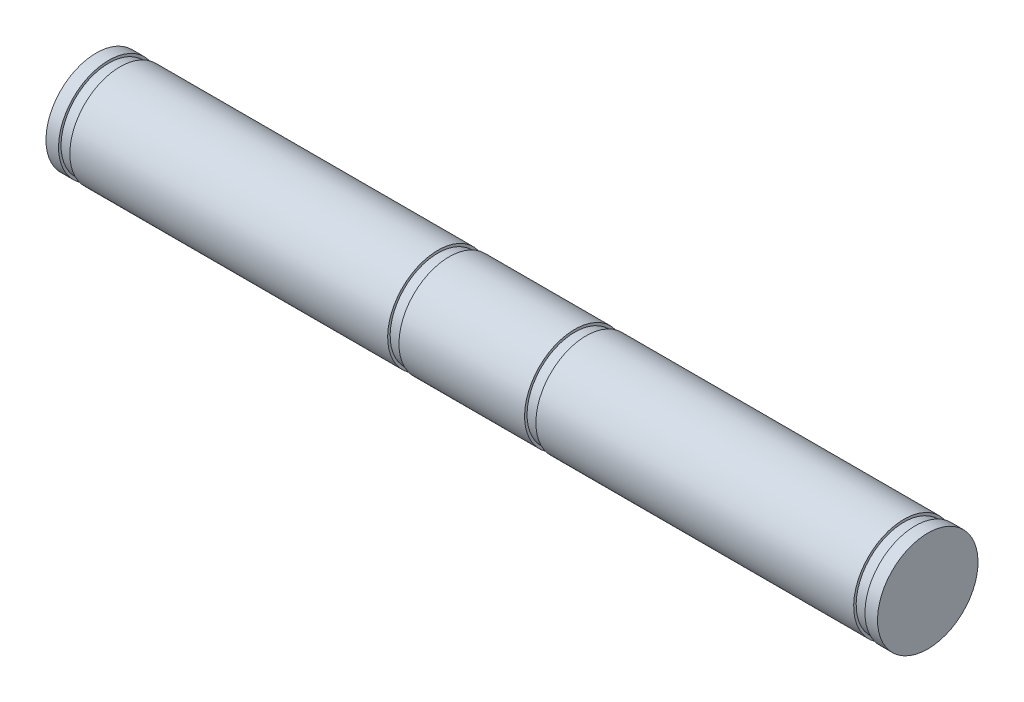
ISO-10303-21;
HEADER;
FILE_DESCRIPTION(('STEP AP214'),'2;1');
FILE_NAME('part.step','',(''),(''),'','','');
FILE_SCHEMA(('AUTOMOTIVE_DESIGN { 1 0 10303 214 1 1 1 1 }'));
ENDSEC;
DATA;
#1=APPLICATION_CONTEXT('core data for automotive mechanical design processes');
#2=APPLICATION_PROTOCOL_DEFINITION('international standard','automotive_design',2000,#1);
#3=PRODUCT_CONTEXT('',#1,'mechanical');
#4=PRODUCT('Part','Part','',(#3));
#5=PRODUCT_RELATED_PRODUCT_CATEGORY('part','',(#4));
#6=PRODUCT_DEFINITION_FORMATION('','',#4);
#7=PRODUCT_DEFINITION_CONTEXT('part definition',#1,'design');
#8=PRODUCT_DEFINITION('design','',#6,#7);
#9=PRODUCT_DEFINITION_SHAPE('','',#8);
#10=(LENGTH_UNIT() NAMED_UNIT(*) SI_UNIT(.MILLI.,.METRE.));
#11=(NAMED_UNIT(*) PLANE_ANGLE_UNIT() SI_UNIT($,.RADIAN.));
#12=(NAMED_UNIT(*) SI_UNIT($,.STERADIAN.) SOLID_ANGLE_UNIT());
#13=UNCERTAINTY_MEASURE_WITH_UNIT(LENGTH_MEASURE(1.E-05),#10,'distance_accuracy_value','');
#14=(GEOMETRIC_REPRESENTATION_CONTEXT(3) GLOBAL_UNCERTAINTY_ASSIGNED_CONTEXT((#13)) GLOBAL_UNIT_ASSIGNED_CONTEXT((#10,
#11,#12)) REPRESENTATION_CONTEXT('',''));
#15=CARTESIAN_POINT('',(0.,0.,0.));
#16=DIRECTION('',(0.,0.,1.));
#17=DIRECTION('',(1.,0.,0.));
#18=AXIS2_PLACEMENT_3D('',#15,#16,#17);
#19=CARTESIAN_POINT('',(64.3,0.,0.));
#20=DIRECTION('',(-1.,0.,0.));
#21=DIRECTION('',(0.,-1.,0.));
#22=AXIS2_PLACEMENT_3D('',#19,#20,#21);
#23=PLANE('',#22);
#24=CARTESIAN_POINT('',(64.3,0.,0.));
#25=DIRECTION('',(-1.,0.,0.));
#26=DIRECTION('',(0.,-1.,0.));
#27=AXIS2_PLACEMENT_3D('',#24,#25,#26);
#28=CIRCLE('',#27,3.99999999999999);
#29=CARTESIAN_POINT('',(64.3,-3.99999999999998,0.));
#30=VERTEX_POINT('',#29);
#31=EDGE_CURVE('E10',#30,#30,#28,.T.);
#32=ORIENTED_EDGE('',*,*,#31,.F.);
#33=EDGE_LOOP('',(#32));
#34=FACE_BOUND('',#33,.T.);
#35=ADVANCED_FACE('F35',(#34),#23,.F.);
#36=CARTESIAN_POINT('',(0.,0.,0.));
#37=DIRECTION('',(-1.,0.,0.));
#38=DIRECTION('',(0.,-1.,0.));
#39=AXIS2_PLACEMENT_3D('',#36,#37,#38);
#40=CYLINDRICAL_SURFACE('',#39,3.99999999999999);
#41=CARTESIAN_POINT('',(63.3,0.,0.));
#42=DIRECTION('',(-1.,0.,0.));
#43=DIRECTION('',(0.,-1.,0.));
#44=AXIS2_PLACEMENT_3D('',#41,#42,#43);
#45=CIRCLE('',#44,3.99999999999999);
#46=CARTESIAN_POINT('',(63.3,-3.99999999999998,0.));
#47=VERTEX_POINT('',#46);
#48=EDGE_CURVE('E41',#47,#47,#45,.T.);
#49=ORIENTED_EDGE('',*,*,#48,.F.);
#50=EDGE_LOOP('',(#49));
#51=FACE_BOUND('',#50,.T.);
#52=ORIENTED_EDGE('',*,*,#31,.T.);
#53=EDGE_LOOP('',(#52));
#54=FACE_BOUND('',#53,.T.);
#55=ADVANCED_FACE('F113',(#51,#54),#40,.T.);
#56=CARTESIAN_POINT('',(63.3,0.,0.));
#57=DIRECTION('',(1.,0.,0.));
#58=DIRECTION('',(0.,1.,0.));
#59=AXIS2_PLACEMENT_3D('',#56,#57,#58);
#60=PLANE('',#59);
#61=CARTESIAN_POINT('',(63.3,0.,0.));
#62=DIRECTION('',(-1.,0.,0.));
#63=DIRECTION('',(0.,-1.,0.));
#64=AXIS2_PLACEMENT_3D('',#61,#62,#63);
#65=CIRCLE('',#64,3.79999999999999);
#66=CARTESIAN_POINT('',(63.3,-3.79999999999998,0.));
#67=VERTEX_POINT('',#66);
#68=EDGE_CURVE('E45',#67,#67,#65,.T.);
#69=ORIENTED_EDGE('',*,*,#68,.F.);
#70=EDGE_LOOP('',(#69));
#71=FACE_BOUND('',#70,.T.);
#72=ORIENTED_EDGE('',*,*,#48,.T.);
#73=EDGE_LOOP('',(#72));
#74=FACE_BOUND('',#73,.T.);
#75=ADVANCED_FACE('F118',(#71,#74),#60,.F.);
#76=CARTESIAN_POINT('',(0.,0.,0.));
#77=DIRECTION('',(-1.,0.,0.));
#78=DIRECTION('',(0.,-1.,0.));
#79=AXIS2_PLACEMENT_3D('',#76,#77,#78);
#80=CYLINDRICAL_SURFACE('',#79,3.79999999999999);
#81=CARTESIAN_POINT('',(62.4,0.,0.));
#82=DIRECTION('',(-1.,0.,0.));
#83=DIRECTION('',(0.,-1.,0.));
#84=AXIS2_PLACEMENT_3D('',#81,#82,#83);
#85=CIRCLE('',#84,3.79999999999999);
#86=CARTESIAN_POINT('',(62.4,-3.79999999999998,0.));
#87=VERTEX_POINT('',#86);
#88=EDGE_CURVE('E49',#87,#87,#85,.T.);
#89=ORIENTED_EDGE('',*,*,#88,.F.);
#90=EDGE_LOOP('',(#89));
#91=FACE_BOUND('',#90,.T.);
#92=ORIENTED_EDGE('',*,*,#68,.T.);
#93=EDGE_LOOP('',(#92));
#94=FACE_BOUND('',#93,.T.);
#95=ADVANCED_FACE('F123',(#91,#94),#80,.T.);
#96=CARTESIAN_POINT('',(62.4,0.,0.));
#97=DIRECTION('',(-1.,0.,0.));
#98=DIRECTION('',(0.,-1.,0.));
#99=AXIS2_PLACEMENT_3D('',#96,#97,#98);
#100=PLANE('',#99);
#101=CARTESIAN_POINT('',(62.4,0.,0.));
#102=DIRECTION('',(-1.,0.,0.));
#103=DIRECTION('',(0.,-1.,0.));
#104=AXIS2_PLACEMENT_3D('',#101,#102,#103);
#105=CIRCLE('',#104,3.99999999999999);
#106=CARTESIAN_POINT('',(62.4,-3.99999999999998,0.));
#107=VERTEX_POINT('',#106);
#108=EDGE_CURVE('E54',#107,#107,#105,.T.);
#109=ORIENTED_EDGE('',*,*,#108,.F.);
#110=EDGE_LOOP('',(#109));
#111=FACE_BOUND('',#110,.T.);
#112=ORIENTED_EDGE('',*,*,#88,.T.);
#113=EDGE_LOOP('',(#112));
#114=FACE_BOUND('',#113,.T.);
#115=ADVANCED_FACE('F129',(#111,#114),#100,.F.);
#116=CARTESIAN_POINT('',(0.,0.,0.));
#117=DIRECTION('',(-1.,0.,0.));
#118=DIRECTION('',(0.,-1.,0.));
#119=AXIS2_PLACEMENT_3D('',#116,#117,#118);
#120=CYLINDRICAL_SURFACE('',#119,3.99999999999999);
#121=CARTESIAN_POINT('',(37.1,0.,0.));
#122=DIRECTION('',(-1.,0.,0.));
#123=DIRECTION('',(0.,-1.,0.));
#124=AXIS2_PLACEMENT_3D('',#121,#122,#123);
#125=CIRCLE('',#124,3.99999999999999);
#126=CARTESIAN_POINT('',(37.1,-3.99999999999999,0.));
#127=VERTEX_POINT('',#126);
#128=EDGE_CURVE('E57',#127,#127,#125,.T.);
#129=ORIENTED_EDGE('',*,*,#128,.F.);
#130=EDGE_LOOP('',(#129));
#131=FACE_BOUND('',#130,.T.);
#132=ORIENTED_EDGE('',*,*,#108,.T.);
#133=EDGE_LOOP('',(#132));
#134=FACE_BOUND('',#133,.T.);
#135=ADVANCED_FACE('F133',(#131,#134),#120,.T.);
#136=CARTESIAN_POINT('',(37.1,0.,0.));
#137=DIRECTION('',(1.,0.,0.));
#138=DIRECTION('',(0.,1.,0.));
#139=AXIS2_PLACEMENT_3D('',#136,#137,#138);
#140=PLANE('',#139);
#141=CARTESIAN_POINT('',(37.1,0.,0.));
#142=DIRECTION('',(-1.,0.,0.));
#143=DIRECTION('',(0.,-1.,0.));
#144=AXIS2_PLACEMENT_3D('',#141,#142,#143);
#145=CIRCLE('',#144,3.79999999999999);
#146=CARTESIAN_POINT('',(37.1,-3.79999999999999,0.));
#147=VERTEX_POINT('',#146);
#148=EDGE_CURVE('E60',#147,#147,#145,.T.);
#149=ORIENTED_EDGE('',*,*,#148,.F.);
#150=EDGE_LOOP('',(#149));
#151=FACE_BOUND('',#150,.T.);
#152=ORIENTED_EDGE('',*,*,#128,.T.);
#153=EDGE_LOOP('',(#152));
#154=FACE_BOUND('',#153,.T.);
#155=ADVANCED_FACE('F137',(#151,#154),#140,.F.);
#156=CARTESIAN_POINT('',(0.,0.,0.));
#157=DIRECTION('',(-1.,0.,0.));
#158=DIRECTION('',(0.,-1.,0.));
#159=AXIS2_PLACEMENT_3D('',#156,#157,#158);
#160=CYLINDRICAL_SURFACE('',#159,3.79999999999999);
#161=CARTESIAN_POINT('',(36.2,0.,0.));
#162=DIRECTION('',(-1.,0.,0.));
#163=DIRECTION('',(0.,-1.,0.));
#164=AXIS2_PLACEMENT_3D('',#161,#162,#163);
#165=CIRCLE('',#164,3.79999999999999);
#166=CARTESIAN_POINT('',(36.2,-3.79999999999999,0.));
#167=VERTEX_POINT('',#166);
#168=EDGE_CURVE('E63',#167,#167,#165,.T.);
#169=ORIENTED_EDGE('',*,*,#168,.F.);
#170=EDGE_LOOP('',(#169));
#171=FACE_BOUND('',#170,.T.);
#172=ORIENTED_EDGE('',*,*,#148,.T.);
#173=EDGE_LOOP('',(#172));
#174=FACE_BOUND('',#173,.T.);
#175=ADVANCED_FACE('F141',(#171,#174),#160,.T.);
#176=CARTESIAN_POINT('',(36.2,0.,0.));
#177=DIRECTION('',(-1.,0.,0.));
#178=DIRECTION('',(0.,-1.,0.));
#179=AXIS2_PLACEMENT_3D('',#176,#177,#178);
#180=PLANE('',#179);
#181=CARTESIAN_POINT('',(36.2,0.,0.));
#182=DIRECTION('',(-1.,0.,0.));
#183=DIRECTION('',(0.,-1.,0.));
#184=AXIS2_PLACEMENT_3D('',#181,#182,#183);
#185=CIRCLE('',#184,3.99999999999999);
#186=CARTESIAN_POINT('',(36.2,-3.99999999999999,0.));
#187=VERTEX_POINT('',#186);
#188=EDGE_CURVE('E66',#187,#187,#185,.T.);
#189=ORIENTED_EDGE('',*,*,#188,.F.);
#190=EDGE_LOOP('',(#189));
#191=FACE_BOUND('',#190,.T.);
#192=ORIENTED_EDGE('',*,*,#168,.T.);
#193=EDGE_LOOP('',(#192));
#194=FACE_BOUND('',#193,.T.);
#195=ADVANCED_FACE('F145',(#191,#194),#180,.F.);
#196=CARTESIAN_POINT('',(0.,0.,0.));
#197=DIRECTION('',(-1.,0.,0.));
#198=DIRECTION('',(0.,-1.,0.));
#199=AXIS2_PLACEMENT_3D('',#196,#197,#198);
#200=CYLINDRICAL_SURFACE('',#199,3.99999999999999);
#201=CARTESIAN_POINT('',(26.2,0.,0.));
#202=DIRECTION('',(-1.,0.,0.));
#203=DIRECTION('',(0.,-1.,0.));
#204=AXIS2_PLACEMENT_3D('',#201,#202,#203);
#205=CIRCLE('',#204,3.99999999999999);
#206=CARTESIAN_POINT('',(26.2,-3.99999999999999,0.));
#207=VERTEX_POINT('',#206);
#208=EDGE_CURVE('E69',#207,#207,#205,.T.);
#209=ORIENTED_EDGE('',*,*,#208,.F.);
#210=EDGE_LOOP('',(#209));
#211=FACE_BOUND('',#210,.T.);
#212=ORIENTED_EDGE('',*,*,#188,.T.);
#213=EDGE_LOOP('',(#212));
#214=FACE_BOUND('',#213,.T.);
#215=ADVANCED_FACE('F149',(#211,#214),#200,.T.);
#216=CARTESIAN_POINT('',(26.2,0.,0.));
#217=DIRECTION('',(-1.,0.,0.));
#218=DIRECTION('',(0.,-1.,0.));
#219=AXIS2_PLACEMENT_3D('',#216,#217,#218);
#220=PLANE('',#219);
#221=ORIENTED_EDGE('',*,*,#208,.T.);
#222=EDGE_LOOP('',(#221));
#223=FACE_BOUND('',#222,.T.);
#224=CARTESIAN_POINT('',(26.2,0.,0.));
#225=DIRECTION('',(-1.,0.,0.));
#226=DIRECTION('',(0.,-1.,0.));
#227=AXIS2_PLACEMENT_3D('',#224,#225,#226);
#228=CIRCLE('',#227,3.79999999999999);
#229=CARTESIAN_POINT('',(26.2,-3.79999999999999,0.));
#230=VERTEX_POINT('',#229);
#231=EDGE_CURVE('E72',#230,#230,#228,.T.);
#232=ORIENTED_EDGE('',*,*,#231,.F.);
#233=EDGE_LOOP('',(#232));
#234=FACE_BOUND('',#233,.T.);
#235=ADVANCED_FACE('F153',(#223,#234),#220,.T.);
#236=CARTESIAN_POINT('',(0.,0.,0.));
#237=DIRECTION('',(-1.,0.,0.));
#238=DIRECTION('',(0.,-1.,0.));
#239=AXIS2_PLACEMENT_3D('',#236,#237,#238);
#240=CYLINDRICAL_SURFACE('',#239,3.79999999999999);
#241=ORIENTED_EDGE('',*,*,#231,.T.);
#242=EDGE_LOOP('',(#241));
#243=FACE_BOUND('',#242,.T.);
#244=CARTESIAN_POINT('',(25.3,0.,0.));
#245=DIRECTION('',(-1.,0.,0.));
#246=DIRECTION('',(0.,-1.,0.));
#247=AXIS2_PLACEMENT_3D('',#244,#245,#246);
#248=CIRCLE('',#247,3.79999999999999);
#249=CARTESIAN_POINT('',(25.3,-3.79999999999999,0.));
#250=VERTEX_POINT('',#249);
#251=EDGE_CURVE('E75',#250,#250,#248,.T.);
#252=ORIENTED_EDGE('',*,*,#251,.F.);
#253=EDGE_LOOP('',(#252));
#254=FACE_BOUND('',#253,.T.);
#255=ADVANCED_FACE('F157',(#243,#254),#240,.T.);
#256=CARTESIAN_POINT('',(25.3,0.,0.));
#257=DIRECTION('',(1.,0.,0.));
#258=DIRECTION('',(0.,1.,0.));
#259=AXIS2_PLACEMENT_3D('',#256,#257,#258);
#260=PLANE('',#259);
#261=ORIENTED_EDGE('',*,*,#251,.T.);
#262=EDGE_LOOP('',(#261));
#263=FACE_BOUND('',#262,.T.);
#264=CARTESIAN_POINT('',(25.3,0.,0.));
#265=DIRECTION('',(-1.,0.,0.));
#266=DIRECTION('',(0.,-1.,0.));
#267=AXIS2_PLACEMENT_3D('',#264,#265,#266);
#268=CIRCLE('',#267,3.99999999999999);
#269=CARTESIAN_POINT('',(25.3,-3.99999999999999,0.));
#270=VERTEX_POINT('',#269);
#271=EDGE_CURVE('E78',#270,#270,#268,.T.);
#272=ORIENTED_EDGE('',*,*,#271,.F.);
#273=EDGE_LOOP('',(#272));
#274=FACE_BOUND('',#273,.T.);
#275=ADVANCED_FACE('F161',(#263,#274),#260,.T.);
#276=CARTESIAN_POINT('',(0.,0.,0.));
#277=DIRECTION('',(-1.,0.,0.));
#278=DIRECTION('',(0.,-1.,0.));
#279=AXIS2_PLACEMENT_3D('',#276,#277,#278);
#280=CYLINDRICAL_SURFACE('',#279,3.99999999999999);
#281=CARTESIAN_POINT('',(0.,0.,0.));
#282=DIRECTION('',(-1.,0.,0.));
#283=DIRECTION('',(0.,-1.,0.));
#284=AXIS2_PLACEMENT_3D('',#281,#282,#283);
#285=CIRCLE('',#284,3.99999999999999);
#286=CARTESIAN_POINT('',(0.,-3.99999999999999,0.));
#287=VERTEX_POINT('',#286);
#288=EDGE_CURVE('E81',#287,#287,#285,.T.);
#289=ORIENTED_EDGE('',*,*,#288,.F.);
#290=EDGE_LOOP('',(#289));
#291=FACE_BOUND('',#290,.T.);
#292=ORIENTED_EDGE('',*,*,#271,.T.);
#293=EDGE_LOOP('',(#292));
#294=FACE_BOUND('',#293,.T.);
#295=ADVANCED_FACE('F165',(#291,#294),#280,.T.);
#296=CARTESIAN_POINT('',(0.,0.,0.));
#297=DIRECTION('',(1.,0.,0.));
#298=DIRECTION('',(0.,1.,0.));
#299=AXIS2_PLACEMENT_3D('',#296,#297,#298);
#300=PLANE('',#299);
#301=CARTESIAN_POINT('',(0.,0.,0.));
#302=DIRECTION('',(-1.,0.,0.));
#303=DIRECTION('',(0.,-1.,0.));
#304=AXIS2_PLACEMENT_3D('',#301,#302,#303);
#305=CIRCLE('',#304,3.80000000000004);
#306=CARTESIAN_POINT('',(0.,-3.80000000000004,0.));
#307=VERTEX_POINT('',#306);
#308=EDGE_CURVE('E84',#307,#307,#305,.T.);
#309=ORIENTED_EDGE('',*,*,#308,.F.);
#310=EDGE_LOOP('',(#309));
#311=FACE_BOUND('',#310,.T.);
#312=ORIENTED_EDGE('',*,*,#288,.T.);
#313=EDGE_LOOP('',(#312));
#314=FACE_BOUND('',#313,.T.);
#315=ADVANCED_FACE('F169',(#311,#314),#300,.F.);
#316=CARTESIAN_POINT('',(0.,0.,0.));
#317=DIRECTION('',(-1.,0.,0.));
#318=DIRECTION('',(0.,-1.,0.));
#319=AXIS2_PLACEMENT_3D('',#316,#317,#318);
#320=CYLINDRICAL_SURFACE('',#319,3.80000000000004);
#321=ORIENTED_EDGE('',*,*,#308,.T.);
#322=EDGE_LOOP('',(#321));
#323=FACE_BOUND('',#322,.T.);
#324=CARTESIAN_POINT('',(-0.899999999999998,0.,0.));
#325=DIRECTION('',(-1.,0.,0.));
#326=DIRECTION('',(0.,-1.,0.));
#327=AXIS2_PLACEMENT_3D('',#324,#325,#326);
#328=CIRCLE('',#327,3.80000000000004);
#329=CARTESIAN_POINT('',(-0.899999999999997,-3.80000000000004,0.));
#330=VERTEX_POINT('',#329);
#331=EDGE_CURVE('E87',#330,#330,#328,.T.);
#332=ORIENTED_EDGE('',*,*,#331,.F.);
#333=EDGE_LOOP('',(#332));
#334=FACE_BOUND('',#333,.T.);
#335=ADVANCED_FACE('F109',(#323,#334),#320,.T.);
#336=CARTESIAN_POINT('',(-0.899999999999997,0.,0.));
#337=DIRECTION('',(1.,0.,0.));
#338=DIRECTION('',(0.,1.,0.));
#339=AXIS2_PLACEMENT_3D('',#336,#337,#338);
#340=PLANE('',#339);
#341=ORIENTED_EDGE('',*,*,#331,.T.);
#342=EDGE_LOOP('',(#341));
#343=FACE_BOUND('',#342,.T.);
#344=CARTESIAN_POINT('',(-0.899999999999997,0.,0.));
#345=DIRECTION('',(-1.,0.,0.));
#346=DIRECTION('',(0.,-1.,0.));
#347=AXIS2_PLACEMENT_3D('',#344,#345,#346);
#348=CIRCLE('',#347,4.00000000000005);
#349=CARTESIAN_POINT('',(-0.899999999999997,-4.00000000000005,0.));
#350=VERTEX_POINT('',#349);
#351=EDGE_CURVE('E90',#350,#350,#348,.T.);
#352=ORIENTED_EDGE('',*,*,#351,.F.);
#353=EDGE_LOOP('',(#352));
#354=FACE_BOUND('',#353,.T.);
#355=ADVANCED_FACE('F101',(#343,#354),#340,.T.);
#356=CARTESIAN_POINT('',(0.,0.,0.));
#357=DIRECTION('',(-1.,0.,0.));
#358=DIRECTION('',(0.,-1.,0.));
#359=AXIS2_PLACEMENT_3D('',#356,#357,#358);
#360=CYLINDRICAL_SURFACE('',#359,4.00000000000005);
#361=ORIENTED_EDGE('',*,*,#351,.T.);
#362=EDGE_LOOP('',(#361));
#363=FACE_BOUND('',#362,.T.);
#364=CARTESIAN_POINT('',(-1.9,0.,0.));
#365=DIRECTION('',(-1.,0.,0.));
#366=DIRECTION('',(0.,-1.,0.));
#367=AXIS2_PLACEMENT_3D('',#364,#365,#366);
#368=CIRCLE('',#367,4.00000000000005);
#369=CARTESIAN_POINT('',(-1.9,-4.00000000000005,0.));
#370=VERTEX_POINT('',#369);
#371=EDGE_CURVE('E93',#370,#370,#368,.T.);
#372=ORIENTED_EDGE('',*,*,#371,.F.);
#373=EDGE_LOOP('',(#372));
#374=FACE_BOUND('',#373,.T.);
#375=ADVANCED_FACE('F99',(#363,#374),#360,.T.);
#376=CARTESIAN_POINT('',(-1.9,0.,0.));
#377=DIRECTION('',(-1.,0.,0.));
#378=DIRECTION('',(0.,-1.,0.));
#379=AXIS2_PLACEMENT_3D('',#376,#377,#378);
#380=PLANE('',#379);
#381=ORIENTED_EDGE('',*,*,#371,.T.);
#382=EDGE_LOOP('',(#381));
#383=FACE_BOUND('',#382,.T.);
#384=ADVANCED_FACE('F97',(#383),#380,.T.);
#385=CLOSED_SHELL('',(#35,#55,#75,#95,#115,#135,#155,#175,#195,#215,#235,#255,#275,#295,#315,
#335,#355,#375,#384));
#386=MANIFOLD_SOLID_BREP('B2',#385);
#387=ADVANCED_BREP_SHAPE_REPRESENTATION('',(#18,#386),#14);
#388=SHAPE_DEFINITION_REPRESENTATION(#9,#387);
ENDSEC;
END-ISO-10303-21;
